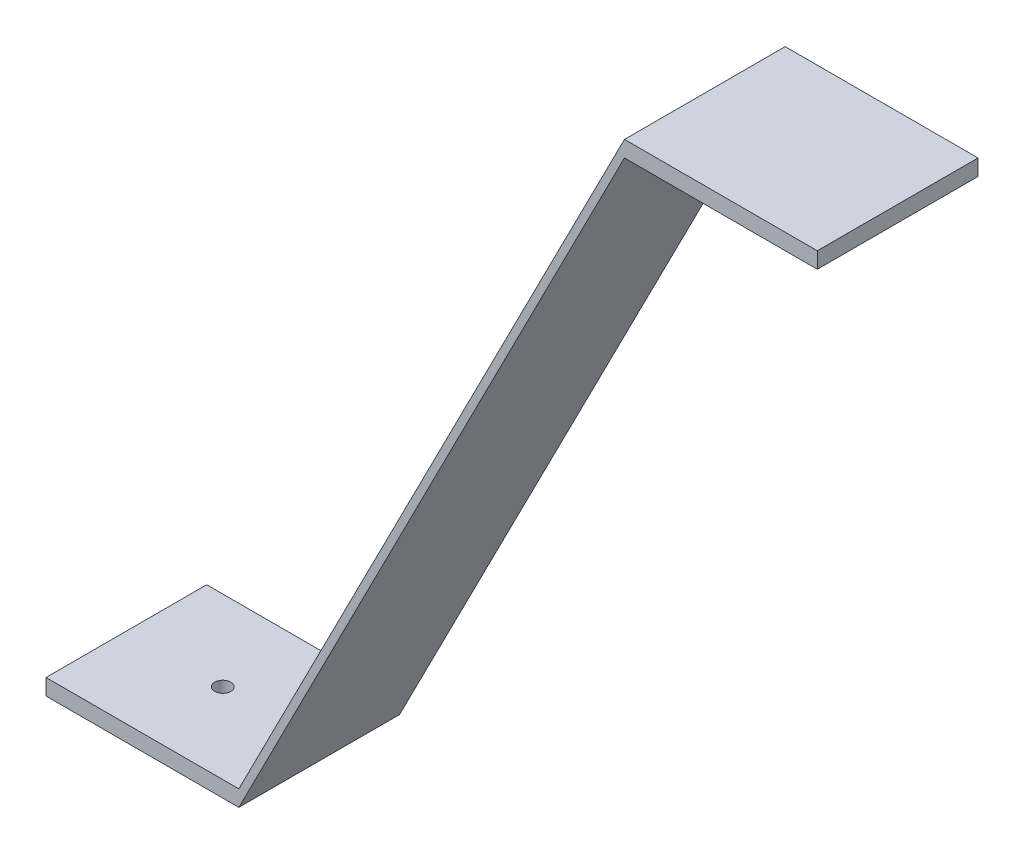
ISO-10303-21;
HEADER;
FILE_DESCRIPTION(('STEP AP214'),'2;1');
FILE_NAME('part.step','',(''),(''),'','','');
FILE_SCHEMA(('AUTOMOTIVE_DESIGN { 1 0 10303 214 1 1 1 1 }'));
ENDSEC;
DATA;
#1=APPLICATION_CONTEXT('core data for automotive mechanical design processes');
#2=APPLICATION_PROTOCOL_DEFINITION('international standard','automotive_design',2000,#1);
#3=PRODUCT_CONTEXT('',#1,'mechanical');
#4=PRODUCT('Part','Part','',(#3));
#5=PRODUCT_RELATED_PRODUCT_CATEGORY('part','',(#4));
#6=PRODUCT_DEFINITION_FORMATION('','',#4);
#7=PRODUCT_DEFINITION_CONTEXT('part definition',#1,'design');
#8=PRODUCT_DEFINITION('design','',#6,#7);
#9=PRODUCT_DEFINITION_SHAPE('','',#8);
#10=(LENGTH_UNIT() NAMED_UNIT(*) SI_UNIT(.MILLI.,.METRE.));
#11=(NAMED_UNIT(*) PLANE_ANGLE_UNIT() SI_UNIT($,.RADIAN.));
#12=(NAMED_UNIT(*) SI_UNIT($,.STERADIAN.) SOLID_ANGLE_UNIT());
#13=UNCERTAINTY_MEASURE_WITH_UNIT(LENGTH_MEASURE(1.E-05),#10,'distance_accuracy_value','');
#14=(GEOMETRIC_REPRESENTATION_CONTEXT(3) GLOBAL_UNCERTAINTY_ASSIGNED_CONTEXT((#13)) GLOBAL_UNIT_ASSIGNED_CONTEXT((#10,
#11,#12)) REPRESENTATION_CONTEXT('',''));
#15=CARTESIAN_POINT('',(0.,0.,0.));
#16=DIRECTION('',(0.,0.,1.));
#17=DIRECTION('',(1.,0.,0.));
#18=AXIS2_PLACEMENT_3D('',#15,#16,#17);
#19=CARTESIAN_POINT('',(-38.1,6.35,-31.75));
#20=DIRECTION('',(0.,0.,1.));
#21=DIRECTION('',(1.,0.,0.));
#22=AXIS2_PLACEMENT_3D('',#19,#20,#21);
#23=PLANE('',#22);
#24=DIRECTION('',(-1.,0.,0.));
#25=VECTOR('',#24,1.);
#26=CARTESIAN_POINT('',(-38.1,0.,-31.75));
#27=LINE('',#26,#25);
#28=CARTESIAN_POINT('',(38.1,0.,-31.75));
#29=VERTEX_POINT('',#28);
#30=CARTESIAN_POINT('',(-38.1,0.,-31.75));
#31=VERTEX_POINT('',#30);
#32=EDGE_CURVE('E69',#29,#31,#27,.T.);
#33=ORIENTED_EDGE('',*,*,#32,.T.);
#34=DIRECTION('',(0.,-1.,0.));
#35=VECTOR('',#34,1.);
#36=CARTESIAN_POINT('',(-38.1,6.35,-31.75));
#37=LINE('',#36,#35);
#38=CARTESIAN_POINT('',(-38.1,6.35,-31.75));
#39=VERTEX_POINT('',#38);
#40=EDGE_CURVE('E11',#39,#31,#37,.T.);
#41=ORIENTED_EDGE('',*,*,#40,.F.);
#42=DIRECTION('',(-1.,0.,0.));
#43=VECTOR('',#42,1.);
#44=CARTESIAN_POINT('',(-38.1,6.35,-31.75));
#45=LINE('',#44,#43);
#46=CARTESIAN_POINT('',(38.1,6.35,-31.75));
#47=VERTEX_POINT('',#46);
#48=EDGE_CURVE('E81',#47,#39,#45,.T.);
#49=ORIENTED_EDGE('',*,*,#48,.F.);
#50=DIRECTION('',(-0.454777156548668,-0.890605264907809,0.));
#51=VECTOR('',#50,1.);
#52=CARTESIAN_POINT('',(38.1,6.35,-31.75));
#53=LINE('',#52,#51);
#54=CARTESIAN_POINT('',(190.5,304.8,-31.75));
#55=VERTEX_POINT('',#54);
#56=EDGE_CURVE('E146',#55,#47,#53,.T.);
#57=ORIENTED_EDGE('',*,*,#56,.F.);
#58=DIRECTION('',(-1.,0.,0.));
#59=VECTOR('',#58,1.);
#60=CARTESIAN_POINT('',(266.7,304.8,-31.75));
#61=LINE('',#60,#59);
#62=CARTESIAN_POINT('',(266.7,304.8,-31.75));
#63=VERTEX_POINT('',#62);
#64=EDGE_CURVE('E140',#63,#55,#61,.T.);
#65=ORIENTED_EDGE('',*,*,#64,.F.);
#66=DIRECTION('',(0.,1.,0.));
#67=VECTOR('',#66,1.);
#68=CARTESIAN_POINT('',(266.7,304.8,-31.75));
#69=LINE('',#68,#67);
#70=CARTESIAN_POINT('',(266.7,298.449999999999,-31.75));
#71=VERTEX_POINT('',#70);
#72=EDGE_CURVE('E121',#71,#63,#69,.T.);
#73=ORIENTED_EDGE('',*,*,#72,.F.);
#74=DIRECTION('',(-1.,0.,0.));
#75=VECTOR('',#74,1.);
#76=CARTESIAN_POINT('',(266.7,298.449999999999,-31.75));
#77=LINE('',#76,#75);
#78=CARTESIAN_POINT('',(190.5,298.45,-31.75));
#79=VERTEX_POINT('',#78);
#80=EDGE_CURVE('E118',#71,#79,#77,.T.);
#81=ORIENTED_EDGE('',*,*,#80,.T.);
#82=DIRECTION('',(0.454777156548669,0.890605264907809,0.));
#83=VECTOR('',#82,1.);
#84=CARTESIAN_POINT('',(38.1,0.,-31.75));
#85=LINE('',#84,#83);
#86=EDGE_CURVE('E144',#29,#79,#85,.T.);
#87=ORIENTED_EDGE('',*,*,#86,.F.);
#88=EDGE_LOOP('',(#33,#41,#49,#57,#65,#73,#81,#87));
#89=FACE_BOUND('',#88,.T.);
#90=ADVANCED_FACE('F39',(#89),#23,.F.);
#91=CARTESIAN_POINT('',(-38.1,6.35,31.75));
#92=DIRECTION('',(1.,0.,0.));
#93=DIRECTION('',(0.,0.,-1.));
#94=AXIS2_PLACEMENT_3D('',#91,#92,#93);
#95=PLANE('',#94);
#96=DIRECTION('',(0.,0.,1.));
#97=VECTOR('',#96,1.);
#98=CARTESIAN_POINT('',(-38.1,0.,31.75));
#99=LINE('',#98,#97);
#100=CARTESIAN_POINT('',(-38.1,0.,31.75));
#101=VERTEX_POINT('',#100);
#102=EDGE_CURVE('E75',#31,#101,#99,.T.);
#103=ORIENTED_EDGE('',*,*,#102,.T.);
#104=DIRECTION('',(0.,-1.,0.));
#105=VECTOR('',#104,1.);
#106=CARTESIAN_POINT('',(-38.1,6.35,31.75));
#107=LINE('',#106,#105);
#108=CARTESIAN_POINT('',(-38.1,6.35,31.75));
#109=VERTEX_POINT('',#108);
#110=EDGE_CURVE('E47',#109,#101,#107,.T.);
#111=ORIENTED_EDGE('',*,*,#110,.F.);
#112=DIRECTION('',(0.,0.,1.));
#113=VECTOR('',#112,1.);
#114=CARTESIAN_POINT('',(-38.1,6.35,31.75));
#115=LINE('',#114,#113);
#116=EDGE_CURVE('E167',#39,#109,#115,.T.);
#117=ORIENTED_EDGE('',*,*,#116,.F.);
#118=ORIENTED_EDGE('',*,*,#40,.T.);
#119=EDGE_LOOP('',(#103,#111,#117,#118));
#120=FACE_BOUND('',#119,.T.);
#121=ADVANCED_FACE('F191',(#120),#95,.F.);
#122=CARTESIAN_POINT('',(-38.1,6.35,31.75));
#123=DIRECTION('',(0.,0.,-1.));
#124=DIRECTION('',(-1.,0.,0.));
#125=AXIS2_PLACEMENT_3D('',#122,#123,#124);
#126=PLANE('',#125);
#127=DIRECTION('',(1.,0.,0.));
#128=VECTOR('',#127,1.);
#129=CARTESIAN_POINT('',(-38.1,0.,31.75));
#130=LINE('',#129,#128);
#131=CARTESIAN_POINT('',(38.1,0.,31.75));
#132=VERTEX_POINT('',#131);
#133=EDGE_CURVE('E165',#101,#132,#130,.T.);
#134=ORIENTED_EDGE('',*,*,#133,.T.);
#135=DIRECTION('',(0.454777156548669,0.890605264907809,0.));
#136=VECTOR('',#135,1.);
#137=CARTESIAN_POINT('',(38.1,0.,31.75));
#138=LINE('',#137,#136);
#139=CARTESIAN_POINT('',(190.5,298.45,31.75));
#140=VERTEX_POINT('',#139);
#141=EDGE_CURVE('E136',#132,#140,#138,.T.);
#142=ORIENTED_EDGE('',*,*,#141,.T.);
#143=DIRECTION('',(-1.,0.,0.));
#144=VECTOR('',#143,1.);
#145=CARTESIAN_POINT('',(266.7,298.449999999999,31.75));
#146=LINE('',#145,#144);
#147=CARTESIAN_POINT('',(266.7,298.449999999999,31.75));
#148=VERTEX_POINT('',#147);
#149=EDGE_CURVE('E116',#148,#140,#146,.T.);
#150=ORIENTED_EDGE('',*,*,#149,.F.);
#151=DIRECTION('',(0.,-1.,0.));
#152=VECTOR('',#151,1.);
#153=CARTESIAN_POINT('',(266.7,304.8,31.75));
#154=LINE('',#153,#152);
#155=CARTESIAN_POINT('',(266.7,304.8,31.75));
#156=VERTEX_POINT('',#155);
#157=EDGE_CURVE('E122',#156,#148,#154,.T.);
#158=ORIENTED_EDGE('',*,*,#157,.F.);
#159=DIRECTION('',(-1.,0.,0.));
#160=VECTOR('',#159,1.);
#161=CARTESIAN_POINT('',(266.7,304.8,31.75));
#162=LINE('',#161,#160);
#163=CARTESIAN_POINT('',(190.5,304.8,31.75));
#164=VERTEX_POINT('',#163);
#165=EDGE_CURVE('E183',#156,#164,#162,.T.);
#166=ORIENTED_EDGE('',*,*,#165,.T.);
#167=DIRECTION('',(-0.454777156548668,-0.890605264907809,0.));
#168=VECTOR('',#167,1.);
#169=CARTESIAN_POINT('',(38.1,6.35,31.75));
#170=LINE('',#169,#168);
#171=CARTESIAN_POINT('',(38.1,6.35,31.75));
#172=VERTEX_POINT('',#171);
#173=EDGE_CURVE('E138',#164,#172,#170,.T.);
#174=ORIENTED_EDGE('',*,*,#173,.T.);
#175=DIRECTION('',(1.,0.,0.));
#176=VECTOR('',#175,1.);
#177=CARTESIAN_POINT('',(-38.1,6.35,31.75));
#178=LINE('',#177,#176);
#179=EDGE_CURVE('E55',#109,#172,#178,.T.);
#180=ORIENTED_EDGE('',*,*,#179,.F.);
#181=ORIENTED_EDGE('',*,*,#110,.T.);
#182=EDGE_LOOP('',(#134,#142,#150,#158,#166,#174,#180,#181));
#183=FACE_BOUND('',#182,.T.);
#184=ADVANCED_FACE('F134',(#183),#126,.F.);
#185=CARTESIAN_POINT('',(0.,6.35,0.));
#186=DIRECTION('',(0.,-1.,0.));
#187=DIRECTION('',(0.,0.,-1.));
#188=AXIS2_PLACEMENT_3D('',#185,#186,#187);
#189=PLANE('',#188);
#190=CARTESIAN_POINT('',(0.,6.35,0.));
#191=DIRECTION('',(0.,1.,0.));
#192=DIRECTION('',(0.,0.,1.));
#193=AXIS2_PLACEMENT_3D('',#190,#191,#192);
#194=CIRCLE('',#193,3.175);
#195=CARTESIAN_POINT('',(0.,6.35,3.175));
#196=VERTEX_POINT('',#195);
#197=EDGE_CURVE('E155',#196,#196,#194,.T.);
#198=ORIENTED_EDGE('',*,*,#197,.F.);
#199=EDGE_LOOP('',(#198));
#200=FACE_BOUND('',#199,.T.);
#201=DIRECTION('',(0.,0.,-1.));
#202=VECTOR('',#201,1.);
#203=CARTESIAN_POINT('',(38.1,6.35,31.75));
#204=LINE('',#203,#202);
#205=EDGE_CURVE('E163',#172,#47,#204,.T.);
#206=ORIENTED_EDGE('',*,*,#205,.T.);
#207=ORIENTED_EDGE('',*,*,#48,.T.);
#208=ORIENTED_EDGE('',*,*,#116,.T.);
#209=ORIENTED_EDGE('',*,*,#179,.T.);
#210=EDGE_LOOP('',(#206,#207,#208,#209));
#211=FACE_BOUND('',#210,.T.);
#212=ADVANCED_FACE('F190',(#200,#211),#189,.F.);
#213=CARTESIAN_POINT('',(0.,0.,0.));
#214=DIRECTION('',(0.,-1.,0.));
#215=DIRECTION('',(0.,0.,-1.));
#216=AXIS2_PLACEMENT_3D('',#213,#214,#215);
#217=PLANE('',#216);
#218=CARTESIAN_POINT('',(0.,0.,0.));
#219=DIRECTION('',(0.,1.,0.));
#220=DIRECTION('',(0.,0.,1.));
#221=AXIS2_PLACEMENT_3D('',#218,#219,#220);
#222=CIRCLE('',#221,3.175);
#223=CARTESIAN_POINT('',(0.,0.,3.175));
#224=VERTEX_POINT('',#223);
#225=EDGE_CURVE('E157',#224,#224,#222,.T.);
#226=ORIENTED_EDGE('',*,*,#225,.T.);
#227=EDGE_LOOP('',(#226));
#228=FACE_BOUND('',#227,.T.);
#229=DIRECTION('',(0.,0.,-1.));
#230=VECTOR('',#229,1.);
#231=CARTESIAN_POINT('',(38.1,0.,31.75));
#232=LINE('',#231,#230);
#233=EDGE_CURVE('E160',#132,#29,#232,.T.);
#234=ORIENTED_EDGE('',*,*,#233,.F.);
#235=ORIENTED_EDGE('',*,*,#133,.F.);
#236=ORIENTED_EDGE('',*,*,#102,.F.);
#237=ORIENTED_EDGE('',*,*,#32,.F.);
#238=EDGE_LOOP('',(#234,#235,#236,#237));
#239=FACE_BOUND('',#238,.T.);
#240=ADVANCED_FACE('F177',(#228,#239),#217,.T.);
#241=CARTESIAN_POINT('',(0.,0.,0.));
#242=DIRECTION('',(0.,1.,0.));
#243=DIRECTION('',(0.,0.,1.));
#244=AXIS2_PLACEMENT_3D('',#241,#242,#243);
#245=CYLINDRICAL_SURFACE('',#244,3.175);
#246=ORIENTED_EDGE('',*,*,#225,.F.);
#247=EDGE_LOOP('',(#246));
#248=FACE_BOUND('',#247,.T.);
#249=ORIENTED_EDGE('',*,*,#197,.T.);
#250=EDGE_LOOP('',(#249));
#251=FACE_BOUND('',#250,.T.);
#252=ADVANCED_FACE('F201',(#248,#251),#245,.F.);
#253=CARTESIAN_POINT('',(38.1,6.35,-31.75));
#254=DIRECTION('',(-0.890605264907809,0.454777156548668,0.));
#255=DIRECTION('',(-0.454777156548669,-0.890605264907809,0.));
#256=AXIS2_PLACEMENT_3D('',#253,#254,#255);
#257=PLANE('',#256);
#258=ORIENTED_EDGE('',*,*,#173,.F.);
#259=DIRECTION('',(0.,0.,1.));
#260=VECTOR('',#259,1.);
#261=CARTESIAN_POINT('',(190.5,304.8,-31.75));
#262=LINE('',#261,#260);
#263=EDGE_CURVE('E152',#55,#164,#262,.T.);
#264=ORIENTED_EDGE('',*,*,#263,.F.);
#265=ORIENTED_EDGE('',*,*,#56,.T.);
#266=ORIENTED_EDGE('',*,*,#205,.F.);
#267=EDGE_LOOP('',(#258,#264,#265,#266));
#268=FACE_BOUND('',#267,.T.);
#269=ADVANCED_FACE('F189',(#268),#257,.T.);
#270=CARTESIAN_POINT('',(38.1,0.,-31.75));
#271=DIRECTION('',(0.890605264907808,-0.454777156548668,0.));
#272=DIRECTION('',(0.454777156548669,0.890605264907809,0.));
#273=AXIS2_PLACEMENT_3D('',#270,#271,#272);
#274=PLANE('',#273);
#275=ORIENTED_EDGE('',*,*,#141,.F.);
#276=ORIENTED_EDGE('',*,*,#233,.T.);
#277=ORIENTED_EDGE('',*,*,#86,.T.);
#278=DIRECTION('',(0.,0.,1.));
#279=VECTOR('',#278,1.);
#280=CARTESIAN_POINT('',(190.5,298.45,-31.75));
#281=LINE('',#280,#279);
#282=EDGE_CURVE('E148',#79,#140,#281,.T.);
#283=ORIENTED_EDGE('',*,*,#282,.T.);
#284=EDGE_LOOP('',(#275,#276,#277,#283));
#285=FACE_BOUND('',#284,.T.);
#286=ADVANCED_FACE('F179',(#285),#274,.T.);
#287=CARTESIAN_POINT('',(266.7,298.449999999999,31.75));
#288=DIRECTION('',(0.,1.,0.));
#289=DIRECTION('',(-1.,0.,0.));
#290=AXIS2_PLACEMENT_3D('',#287,#288,#289);
#291=PLANE('',#290);
#292=ORIENTED_EDGE('',*,*,#282,.F.);
#293=ORIENTED_EDGE('',*,*,#80,.F.);
#294=DIRECTION('',(0.,0.,-1.));
#295=VECTOR('',#294,1.);
#296=CARTESIAN_POINT('',(266.7,298.449999999999,31.75));
#297=LINE('',#296,#295);
#298=EDGE_CURVE('E111',#148,#71,#297,.T.);
#299=ORIENTED_EDGE('',*,*,#298,.F.);
#300=ORIENTED_EDGE('',*,*,#149,.T.);
#301=EDGE_LOOP('',(#292,#293,#299,#300));
#302=FACE_BOUND('',#301,.T.);
#303=ADVANCED_FACE('F114',(#302),#291,.F.);
#304=CARTESIAN_POINT('',(266.7,304.8,31.75));
#305=DIRECTION('',(0.,-1.,0.));
#306=DIRECTION('',(1.,0.,0.));
#307=AXIS2_PLACEMENT_3D('',#304,#305,#306);
#308=PLANE('',#307);
#309=ORIENTED_EDGE('',*,*,#263,.T.);
#310=ORIENTED_EDGE('',*,*,#165,.F.);
#311=DIRECTION('',(0.,0.,1.));
#312=VECTOR('',#311,1.);
#313=CARTESIAN_POINT('',(266.7,304.8,31.75));
#314=LINE('',#313,#312);
#315=EDGE_CURVE('E127',#63,#156,#314,.T.);
#316=ORIENTED_EDGE('',*,*,#315,.F.);
#317=ORIENTED_EDGE('',*,*,#64,.T.);
#318=EDGE_LOOP('',(#309,#310,#316,#317));
#319=FACE_BOUND('',#318,.T.);
#320=ADVANCED_FACE('F187',(#319),#308,.F.);
#321=CARTESIAN_POINT('',(266.699999999999,-1.16573417585638E-12,0.));
#322=DIRECTION('',(1.,0.,0.));
#323=DIRECTION('',(0.,1.,0.));
#324=AXIS2_PLACEMENT_3D('',#321,#322,#323);
#325=PLANE('',#324);
#326=ORIENTED_EDGE('',*,*,#157,.T.);
#327=ORIENTED_EDGE('',*,*,#298,.T.);
#328=ORIENTED_EDGE('',*,*,#72,.T.);
#329=ORIENTED_EDGE('',*,*,#315,.T.);
#330=EDGE_LOOP('',(#326,#327,#328,#329));
#331=FACE_BOUND('',#330,.T.);
#332=ADVANCED_FACE('F125',(#331),#325,.T.);
#333=CLOSED_SHELL('',(#90,#121,#184,#212,#240,#252,#269,#286,#303,#320,#332));
#334=MANIFOLD_SOLID_BREP('B2',#333);
#335=ADVANCED_BREP_SHAPE_REPRESENTATION('',(#18,#334),#14);
#336=SHAPE_DEFINITION_REPRESENTATION(#9,#335);
ENDSEC;
END-ISO-10303-21;
